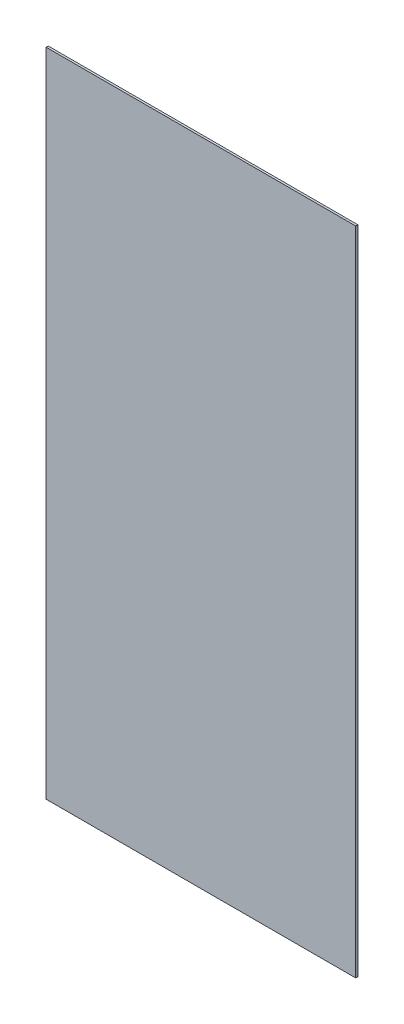
ISO-10303-21;
HEADER;
FILE_DESCRIPTION(('STEP AP214'),'2;1');
FILE_NAME('part.step','',(''),(''),'','','');
FILE_SCHEMA(('AUTOMOTIVE_DESIGN { 1 0 10303 214 1 1 1 1 }'));
ENDSEC;
DATA;
#1=APPLICATION_CONTEXT('core data for automotive mechanical design processes');
#2=APPLICATION_PROTOCOL_DEFINITION('international standard','automotive_design',2000,#1);
#3=PRODUCT_CONTEXT('',#1,'mechanical');
#4=PRODUCT('Part','Part','',(#3));
#5=PRODUCT_RELATED_PRODUCT_CATEGORY('part','',(#4));
#6=PRODUCT_DEFINITION_FORMATION('','',#4);
#7=PRODUCT_DEFINITION_CONTEXT('part definition',#1,'design');
#8=PRODUCT_DEFINITION('design','',#6,#7);
#9=PRODUCT_DEFINITION_SHAPE('','',#8);
#10=(LENGTH_UNIT() NAMED_UNIT(*) SI_UNIT(.MILLI.,.METRE.));
#11=(NAMED_UNIT(*) PLANE_ANGLE_UNIT() SI_UNIT($,.RADIAN.));
#12=(NAMED_UNIT(*) SI_UNIT($,.STERADIAN.) SOLID_ANGLE_UNIT());
#13=UNCERTAINTY_MEASURE_WITH_UNIT(LENGTH_MEASURE(1.E-05),#10,'distance_accuracy_value','');
#14=(GEOMETRIC_REPRESENTATION_CONTEXT(3) GLOBAL_UNCERTAINTY_ASSIGNED_CONTEXT((#13)) GLOBAL_UNIT_ASSIGNED_CONTEXT((#10,
#11,#12)) REPRESENTATION_CONTEXT('',''));
#15=CARTESIAN_POINT('',(0.,0.,0.));
#16=DIRECTION('',(0.,0.,1.));
#17=DIRECTION('',(1.,0.,0.));
#18=AXIS2_PLACEMENT_3D('',#15,#16,#17);
#19=CARTESIAN_POINT('',(145.,305.,2.));
#20=DIRECTION('',(-1.,0.,0.));
#21=DIRECTION('',(0.,-1.,0.));
#22=AXIS2_PLACEMENT_3D('',#19,#20,#21);
#23=PLANE('',#22);
#24=DIRECTION('',(0.,1.,0.));
#25=VECTOR('',#24,1.);
#26=CARTESIAN_POINT('',(145.,305.,0.));
#27=LINE('',#26,#25);
#28=CARTESIAN_POINT('',(145.,-305.,0.));
#29=VERTEX_POINT('',#28);
#30=CARTESIAN_POINT('',(145.,305.,0.));
#31=VERTEX_POINT('',#30);
#32=EDGE_CURVE('E98',#29,#31,#27,.T.);
#33=ORIENTED_EDGE('',*,*,#32,.T.);
#34=DIRECTION('',(0.,0.,-1.));
#35=VECTOR('',#34,1.);
#36=CARTESIAN_POINT('',(145.,305.,2.));
#37=LINE('',#36,#35);
#38=CARTESIAN_POINT('',(145.,305.,2.));
#39=VERTEX_POINT('',#38);
#40=EDGE_CURVE('E11',#39,#31,#37,.T.);
#41=ORIENTED_EDGE('',*,*,#40,.F.);
#42=DIRECTION('',(0.,1.,0.));
#43=VECTOR('',#42,1.);
#44=CARTESIAN_POINT('',(145.,305.,2.));
#45=LINE('',#44,#43);
#46=CARTESIAN_POINT('',(145.,-305.,2.));
#47=VERTEX_POINT('',#46);
#48=EDGE_CURVE('E86',#47,#39,#45,.T.);
#49=ORIENTED_EDGE('',*,*,#48,.F.);
#50=DIRECTION('',(0.,0.,-1.));
#51=VECTOR('',#50,1.);
#52=CARTESIAN_POINT('',(145.,-305.,2.));
#53=LINE('',#52,#51);
#54=EDGE_CURVE('E94',#47,#29,#53,.T.);
#55=ORIENTED_EDGE('',*,*,#54,.T.);
#56=EDGE_LOOP('',(#33,#41,#49,#55));
#57=FACE_BOUND('',#56,.T.);
#58=ADVANCED_FACE('F35',(#57),#23,.F.);
#59=CARTESIAN_POINT('',(-145.,305.,2.));
#60=DIRECTION('',(0.,-1.,0.));
#61=DIRECTION('',(0.,0.,-1.));
#62=AXIS2_PLACEMENT_3D('',#59,#60,#61);
#63=PLANE('',#62);
#64=DIRECTION('',(-1.,0.,0.));
#65=VECTOR('',#64,1.);
#66=CARTESIAN_POINT('',(-145.,305.,0.));
#67=LINE('',#66,#65);
#68=CARTESIAN_POINT('',(-145.,305.,0.));
#69=VERTEX_POINT('',#68);
#70=EDGE_CURVE('E90',#31,#69,#67,.T.);
#71=ORIENTED_EDGE('',*,*,#70,.T.);
#72=DIRECTION('',(0.,0.,-1.));
#73=VECTOR('',#72,1.);
#74=CARTESIAN_POINT('',(-145.,305.,2.));
#75=LINE('',#74,#73);
#76=CARTESIAN_POINT('',(-145.,305.,2.));
#77=VERTEX_POINT('',#76);
#78=EDGE_CURVE('E43',#77,#69,#75,.T.);
#79=ORIENTED_EDGE('',*,*,#78,.F.);
#80=DIRECTION('',(-1.,0.,0.));
#81=VECTOR('',#80,1.);
#82=CARTESIAN_POINT('',(-145.,305.,2.));
#83=LINE('',#82,#81);
#84=EDGE_CURVE('E81',#39,#77,#83,.T.);
#85=ORIENTED_EDGE('',*,*,#84,.F.);
#86=ORIENTED_EDGE('',*,*,#40,.T.);
#87=EDGE_LOOP('',(#71,#79,#85,#86));
#88=FACE_BOUND('',#87,.T.);
#89=ADVANCED_FACE('F89',(#88),#63,.F.);
#90=CARTESIAN_POINT('',(-145.,305.,2.));
#91=DIRECTION('',(1.,0.,0.));
#92=DIRECTION('',(0.,1.,0.));
#93=AXIS2_PLACEMENT_3D('',#90,#91,#92);
#94=PLANE('',#93);
#95=DIRECTION('',(0.,-1.,0.));
#96=VECTOR('',#95,1.);
#97=CARTESIAN_POINT('',(-145.,305.,0.));
#98=LINE('',#97,#96);
#99=CARTESIAN_POINT('',(-145.,-305.,0.));
#100=VERTEX_POINT('',#99);
#101=EDGE_CURVE('E68',#69,#100,#98,.T.);
#102=ORIENTED_EDGE('',*,*,#101,.T.);
#103=DIRECTION('',(0.,0.,-1.));
#104=VECTOR('',#103,1.);
#105=CARTESIAN_POINT('',(-145.,-305.,2.));
#106=LINE('',#105,#104);
#107=CARTESIAN_POINT('',(-145.,-305.,2.));
#108=VERTEX_POINT('',#107);
#109=EDGE_CURVE('E91',#108,#100,#106,.T.);
#110=ORIENTED_EDGE('',*,*,#109,.F.);
#111=DIRECTION('',(0.,-1.,0.));
#112=VECTOR('',#111,1.);
#113=CARTESIAN_POINT('',(-145.,305.,2.));
#114=LINE('',#113,#112);
#115=EDGE_CURVE('E84',#77,#108,#114,.T.);
#116=ORIENTED_EDGE('',*,*,#115,.F.);
#117=ORIENTED_EDGE('',*,*,#78,.T.);
#118=EDGE_LOOP('',(#102,#110,#116,#117));
#119=FACE_BOUND('',#118,.T.);
#120=ADVANCED_FACE('F92',(#119),#94,.F.);
#121=CARTESIAN_POINT('',(-145.,-305.,2.));
#122=DIRECTION('',(0.,1.,0.));
#123=DIRECTION('',(0.,0.,1.));
#124=AXIS2_PLACEMENT_3D('',#121,#122,#123);
#125=PLANE('',#124);
#126=DIRECTION('',(1.,0.,0.));
#127=VECTOR('',#126,1.);
#128=CARTESIAN_POINT('',(-145.,-305.,0.));
#129=LINE('',#128,#127);
#130=EDGE_CURVE('E74',#100,#29,#129,.T.);
#131=ORIENTED_EDGE('',*,*,#130,.T.);
#132=ORIENTED_EDGE('',*,*,#54,.F.);
#133=DIRECTION('',(1.,0.,0.));
#134=VECTOR('',#133,1.);
#135=CARTESIAN_POINT('',(-145.,-305.,2.));
#136=LINE('',#135,#134);
#137=EDGE_CURVE('E51',#108,#47,#136,.T.);
#138=ORIENTED_EDGE('',*,*,#137,.F.);
#139=ORIENTED_EDGE('',*,*,#109,.T.);
#140=EDGE_LOOP('',(#131,#132,#138,#139));
#141=FACE_BOUND('',#140,.T.);
#142=ADVANCED_FACE('F105',(#141),#125,.F.);
#143=CARTESIAN_POINT('',(0.,0.,2.));
#144=DIRECTION('',(0.,0.,1.));
#145=DIRECTION('',(1.,0.,0.));
#146=AXIS2_PLACEMENT_3D('',#143,#144,#145);
#147=PLANE('',#146);
#148=ORIENTED_EDGE('',*,*,#48,.T.);
#149=ORIENTED_EDGE('',*,*,#84,.T.);
#150=ORIENTED_EDGE('',*,*,#115,.T.);
#151=ORIENTED_EDGE('',*,*,#137,.T.);
#152=EDGE_LOOP('',(#148,#149,#150,#151));
#153=FACE_BOUND('',#152,.T.);
#154=ADVANCED_FACE('F82',(#153),#147,.T.);
#155=CARTESIAN_POINT('',(0.,0.,0.));
#156=DIRECTION('',(0.,0.,1.));
#157=DIRECTION('',(1.,0.,0.));
#158=AXIS2_PLACEMENT_3D('',#155,#156,#157);
#159=PLANE('',#158);
#160=ORIENTED_EDGE('',*,*,#32,.F.);
#161=ORIENTED_EDGE('',*,*,#130,.F.);
#162=ORIENTED_EDGE('',*,*,#101,.F.);
#163=ORIENTED_EDGE('',*,*,#70,.F.);
#164=EDGE_LOOP('',(#160,#161,#162,#163));
#165=FACE_BOUND('',#164,.T.);
#166=ADVANCED_FACE('F108',(#165),#159,.F.);
#167=CLOSED_SHELL('',(#58,#89,#120,#142,#154,#166));
#168=MANIFOLD_SOLID_BREP('B2',#167);
#169=ADVANCED_BREP_SHAPE_REPRESENTATION('',(#18,#168),#14);
#170=SHAPE_DEFINITION_REPRESENTATION(#9,#169);
ENDSEC;
END-ISO-10303-21;
